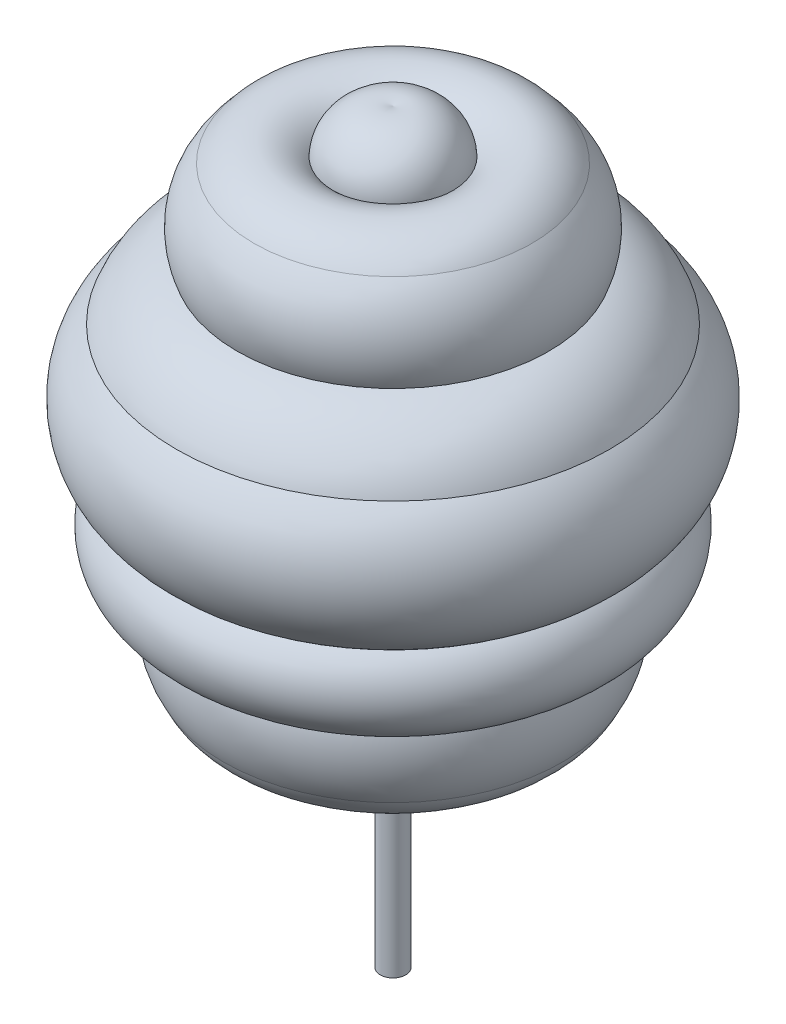
ISO-10303-21;
HEADER;
FILE_DESCRIPTION(('STEP AP214'),'2;1');
FILE_NAME('part.step','',(''),(''),'','','');
FILE_SCHEMA(('AUTOMOTIVE_DESIGN { 1 0 10303 214 1 1 1 1 }'));
ENDSEC;
DATA;
#1=APPLICATION_CONTEXT('core data for automotive mechanical design processes');
#2=APPLICATION_PROTOCOL_DEFINITION('international standard','automotive_design',2000,#1);
#3=PRODUCT_CONTEXT('',#1,'mechanical');
#4=PRODUCT('Part','Part','',(#3));
#5=PRODUCT_RELATED_PRODUCT_CATEGORY('part','',(#4));
#6=PRODUCT_DEFINITION_FORMATION('','',#4);
#7=PRODUCT_DEFINITION_CONTEXT('part definition',#1,'design');
#8=PRODUCT_DEFINITION('design','',#6,#7);
#9=PRODUCT_DEFINITION_SHAPE('','',#8);
#10=(LENGTH_UNIT() NAMED_UNIT(*) SI_UNIT(.MILLI.,.METRE.));
#11=(NAMED_UNIT(*) PLANE_ANGLE_UNIT() SI_UNIT($,.RADIAN.));
#12=(NAMED_UNIT(*) SI_UNIT($,.STERADIAN.) SOLID_ANGLE_UNIT());
#13=UNCERTAINTY_MEASURE_WITH_UNIT(LENGTH_MEASURE(1.E-05),#10,'distance_accuracy_value','');
#14=(GEOMETRIC_REPRESENTATION_CONTEXT(3) GLOBAL_UNCERTAINTY_ASSIGNED_CONTEXT((#13)) GLOBAL_UNIT_ASSIGNED_CONTEXT((#10,
#11,#12)) REPRESENTATION_CONTEXT('',''));
#15=CARTESIAN_POINT('',(0.,0.,0.));
#16=DIRECTION('',(0.,0.,1.));
#17=DIRECTION('',(1.,0.,0.));
#18=AXIS2_PLACEMENT_3D('',#15,#16,#17);
#19=CARTESIAN_POINT('',(0.,0.,0.));
#20=DIRECTION('',(0.,1.,0.));
#21=DIRECTION('',(0.,0.,1.));
#22=AXIS2_PLACEMENT_3D('',#19,#20,#21);
#23=PLANE('',#22);
#24=CARTESIAN_POINT('',(0.,0.,0.));
#25=DIRECTION('',(0.,1.,0.));
#26=DIRECTION('',(0.,0.,1.));
#27=AXIS2_PLACEMENT_3D('',#24,#25,#26);
#28=CIRCLE('',#27,30.);
#29=CARTESIAN_POINT('',(0.,0.,30.));
#30=VERTEX_POINT('',#29);
#31=EDGE_CURVE('E11',#30,#30,#28,.T.);
#32=ORIENTED_EDGE('',*,*,#31,.T.);
#33=EDGE_LOOP('',(#32));
#34=FACE_BOUND('',#33,.T.);
#35=CARTESIAN_POINT('',(0.,0.,0.));
#36=DIRECTION('',(0.,1.,0.));
#37=DIRECTION('',(0.,0.,1.));
#38=AXIS2_PLACEMENT_3D('',#35,#36,#37);
#39=CIRCLE('',#38,139.417105741642);
#40=CARTESIAN_POINT('',(0.,0.,139.417105741642));
#41=VERTEX_POINT('',#40);
#42=EDGE_CURVE('E75',#41,#41,#39,.T.);
#43=ORIENTED_EDGE('',*,*,#42,.F.);
#44=EDGE_LOOP('',(#43));
#45=FACE_BOUND('',#44,.T.);
#46=ADVANCED_FACE('F33',(#34,#45),#23,.F.);
#47=CARTESIAN_POINT('',(0.,99.2068965255332,0.));
#48=DIRECTION('',(0.,1.,0.));
#49=DIRECTION('',(0.,0.,1.));
#50=AXIS2_PLACEMENT_3D('',#47,#48,#49);
#51=TOROIDAL_SURFACE('',#50,139.417105741642,99.2068965255332);
#52=CARTESIAN_POINT('',(0.,54.9088263615796,0.));
#53=DIRECTION('',(0.,1.,0.));
#54=DIRECTION('',(0.,0.,1.));
#55=AXIS2_PLACEMENT_3D('',#52,#53,#54);
#56=CIRCLE('',#55,228.184719756987);
#57=CARTESIAN_POINT('',(0.,54.9088263615796,228.184719756987));
#58=VERTEX_POINT('',#57);
#59=EDGE_CURVE('E72',#58,#58,#56,.T.);
#60=ORIENTED_EDGE('',*,*,#59,.F.);
#61=EDGE_LOOP('',(#60));
#62=FACE_BOUND('',#61,.T.);
#63=ORIENTED_EDGE('',*,*,#42,.T.);
#64=EDGE_LOOP('',(#63));
#65=FACE_BOUND('',#64,.T.);
#66=ADVANCED_FACE('F89',(#62,#65),#51,.T.);
#67=CARTESIAN_POINT('',(0.,166.297519001005,0.));
#68=DIRECTION('',(0.,1.,0.));
#69=DIRECTION('',(0.,0.,1.));
#70=AXIS2_PLACEMENT_3D('',#67,#68,#69);
#71=TOROIDAL_SURFACE('',#70,283.771480500149,124.488267791941);
#72=CARTESIAN_POINT('',(0.,116.008612631882,0.));
#73=DIRECTION('',(0.,1.,0.));
#74=DIRECTION('',(0.,0.,1.));
#75=AXIS2_PLACEMENT_3D('',#72,#73,#74);
#76=CIRCLE('',#75,397.650164695373);
#77=CARTESIAN_POINT('',(0.,116.008612631882,397.650164695373));
#78=VERTEX_POINT('',#77);
#79=EDGE_CURVE('E69',#78,#78,#76,.T.);
#80=ORIENTED_EDGE('',*,*,#79,.F.);
#81=EDGE_LOOP('',(#80));
#82=FACE_BOUND('',#81,.T.);
#83=ORIENTED_EDGE('',*,*,#59,.T.);
#84=EDGE_LOOP('',(#83));
#85=FACE_BOUND('',#84,.T.);
#86=ADVANCED_FACE('F94',(#82,#85),#71,.T.);
#87=CARTESIAN_POINT('',(0.,220.531302933038,0.));
#88=DIRECTION('',(0.,1.,0.));
#89=DIRECTION('',(0.,0.,1.));
#90=AXIS2_PLACEMENT_3D('',#87,#88,#89);
#91=TOROIDAL_SURFACE('',#90,216.378743577582,209.247033197259);
#92=CARTESIAN_POINT('',(0.,287.645111061646,0.));
#93=DIRECTION('',(0.,1.,0.));
#94=DIRECTION('',(0.,0.,1.));
#95=AXIS2_PLACEMENT_3D('',#92,#93,#94);
#96=CIRCLE('',#95,414.570715312896);
#97=CARTESIAN_POINT('',(0.,287.645111061646,414.570715312896));
#98=VERTEX_POINT('',#97);
#99=EDGE_CURVE('E66',#98,#98,#96,.T.);
#100=ORIENTED_EDGE('',*,*,#99,.F.);
#101=EDGE_LOOP('',(#100));
#102=FACE_BOUND('',#101,.T.);
#103=ORIENTED_EDGE('',*,*,#79,.T.);
#104=EDGE_LOOP('',(#103));
#105=FACE_BOUND('',#104,.T.);
#106=ADVANCED_FACE('F101',(#102,#105),#91,.T.);
#107=CARTESIAN_POINT('',(0.,401.126607206565,0.));
#108=DIRECTION('',(0.,1.,0.));
#109=DIRECTION('',(0.,0.,1.));
#110=AXIS2_PLACEMENT_3D('',#107,#108,#109);
#111=TOROIDAL_SURFACE('',#110,414.38855612833,113.481642344733);
#112=CARTESIAN_POINT('',(0.,488.899466331618,0.));
#113=DIRECTION('',(0.,1.,0.));
#114=DIRECTION('',(0.,0.,1.));
#115=AXIS2_PLACEMENT_3D('',#112,#113,#114);
#116=CIRCLE('',#115,486.319136205732);
#117=CARTESIAN_POINT('',(0.,488.899466331618,486.319136205732));
#118=VERTEX_POINT('',#117);
#119=EDGE_CURVE('E63',#118,#118,#116,.T.);
#120=ORIENTED_EDGE('',*,*,#119,.F.);
#121=EDGE_LOOP('',(#120));
#122=FACE_BOUND('',#121,.T.);
#123=ORIENTED_EDGE('',*,*,#99,.T.);
#124=EDGE_LOOP('',(#123));
#125=FACE_BOUND('',#124,.T.);
#126=ADVANCED_FACE('F105',(#122,#125),#111,.T.);
#127=CARTESIAN_POINT('',(0.,656.605914428224,0.));
#128=DIRECTION('',(0.,1.,0.));
#129=DIRECTION('',(0.,0.,1.));
#130=AXIS2_PLACEMENT_3D('',#127,#128,#129);
#131=TOROIDAL_SURFACE('',#130,371.0751291167,203.486200768298);
#132=CARTESIAN_POINT('',(0.,806.811755215966,0.));
#133=DIRECTION('',(0.,1.,0.));
#134=DIRECTION('',(0.,0.,1.));
#135=AXIS2_PLACEMENT_3D('',#132,#133,#134);
#136=CIRCLE('',#135,508.351635833486);
#137=CARTESIAN_POINT('',(0.,806.811755215966,508.351635833486));
#138=VERTEX_POINT('',#137);
#139=EDGE_CURVE('E60',#138,#138,#136,.T.);
#140=ORIENTED_EDGE('',*,*,#139,.F.);
#141=EDGE_LOOP('',(#140));
#142=FACE_BOUND('',#141,.T.);
#143=ORIENTED_EDGE('',*,*,#119,.T.);
#144=EDGE_LOOP('',(#143));
#145=FACE_BOUND('',#144,.T.);
#146=ADVANCED_FACE('F109',(#142,#145),#131,.T.);
#147=CARTESIAN_POINT('',(0.,735.539797725192,0.));
#148=DIRECTION('',(0.,1.,0.));
#149=DIRECTION('',(0.,0.,1.));
#150=AXIS2_PLACEMENT_3D('',#147,#148,#149);
#151=TOROIDAL_SURFACE('',#150,315.980471279254,205.149596335254);
#152=CARTESIAN_POINT('',(0.,934.59602823058,0.));
#153=DIRECTION('',(0.,1.,0.));
#154=DIRECTION('',(0.,0.,1.));
#155=AXIS2_PLACEMENT_3D('',#152,#153,#154);
#156=CIRCLE('',#155,365.608829840703);
#157=CARTESIAN_POINT('',(0.,934.59602823058,365.608829840703));
#158=VERTEX_POINT('',#157);
#159=EDGE_CURVE('E55',#158,#158,#156,.T.);
#160=ORIENTED_EDGE('',*,*,#159,.F.);
#161=EDGE_LOOP('',(#160));
#162=FACE_BOUND('',#161,.T.);
#163=ORIENTED_EDGE('',*,*,#139,.T.);
#164=EDGE_LOOP('',(#163));
#165=FACE_BOUND('',#164,.T.);
#166=ADVANCED_FACE('F113',(#162,#165),#151,.T.);
#167=CARTESIAN_POINT('',(0.,1003.87058263717,0.));
#168=DIRECTION('',(0.,1.,0.));
#169=DIRECTION('',(0.,0.,1.));
#170=AXIS2_PLACEMENT_3D('',#167,#168,#169);
#171=TOROIDAL_SURFACE('',#170,193.371671685515,185.646444990488);
#172=CARTESIAN_POINT('',(0.,1133.77536934445,0.));
#173=DIRECTION('',(0.,1.,0.));
#174=DIRECTION('',(0.,0.,1.));
#175=AXIS2_PLACEMENT_3D('',#172,#173,#174);
#176=CIRCLE('',#175,325.99651448709);
#177=CARTESIAN_POINT('',(0.,1133.77536934445,325.99651448709));
#178=VERTEX_POINT('',#177);
#179=EDGE_CURVE('E52',#178,#178,#176,.T.);
#180=ORIENTED_EDGE('',*,*,#179,.F.);
#181=EDGE_LOOP('',(#180));
#182=FACE_BOUND('',#181,.T.);
#183=ORIENTED_EDGE('',*,*,#159,.T.);
#184=EDGE_LOOP('',(#183));
#185=FACE_BOUND('',#184,.T.);
#186=ADVANCED_FACE('F117',(#182,#185),#171,.T.);
#187=CARTESIAN_POINT('',(0.,1060.73551966089,0.));
#188=DIRECTION('',(0.,1.,0.));
#189=DIRECTION('',(0.,0.,1.));
#190=AXIS2_PLACEMENT_3D('',#187,#188,#189);
#191=TOROIDAL_SURFACE('',#190,226.889478801635,123.113866660727);
#192=CARTESIAN_POINT('',(0.,1147.37043245826,0.));
#193=DIRECTION('',(0.,1.,0.));
#194=DIRECTION('',(0.,0.,1.));
#195=AXIS2_PLACEMENT_3D('',#192,#193,#194);
#196=CIRCLE('',#195,139.417105741642);
#197=CARTESIAN_POINT('',(0.,1147.37043245826,139.417105741642));
#198=VERTEX_POINT('',#197);
#199=EDGE_CURVE('E50',#198,#198,#196,.T.);
#200=ORIENTED_EDGE('',*,*,#199,.F.);
#201=EDGE_LOOP('',(#200));
#202=FACE_BOUND('',#201,.T.);
#203=ORIENTED_EDGE('',*,*,#179,.T.);
#204=EDGE_LOOP('',(#203));
#205=FACE_BOUND('',#204,.T.);
#206=ADVANCED_FACE('F46',(#202,#205),#191,.T.);
#207=CARTESIAN_POINT('',(0.,1142.50458931729,28.3521252394037));
#208=DIRECTION('',(-1.,0.,0.));
#209=DIRECTION('',(0.,0.,1.));
#210=AXIS2_PLACEMENT_3D('',#207,#208,#209);
#211=CIRCLE('',#210,111.171517590771);
#212=TRIMMED_CURVE('',#211,(PARAMETER_VALUE(-1.82867554985619)),
(PARAMETER_VALUE(1.82867554985619)),.T.,.PARAMETER.);
#213=CARTESIAN_POINT('',(0.,1142.50458931729,0.));
#214=DIRECTION('',(0.,1.,0.));
#215=AXIS1_PLACEMENT('',#213,#214);
#216=SURFACE_OF_REVOLUTION('',#212,#215);
#217=CARTESIAN_POINT('',(0.,1250.,0.));
#218=VERTEX_POINT('',#217);
#219=VERTEX_LOOP('',#218);
#220=FACE_BOUND('',#219,.T.);
#221=ORIENTED_EDGE('',*,*,#199,.T.);
#222=EDGE_LOOP('',(#221));
#223=FACE_BOUND('',#222,.T.);
#224=ADVANCED_FACE('F43',(#220,#223),#216,.T.);
#225=CARTESIAN_POINT('',(0.,500.,0.));
#226=DIRECTION('',(0.,-1.,0.));
#227=DIRECTION('',(0.,0.,-1.));
#228=AXIS2_PLACEMENT_3D('',#225,#226,#227);
#229=CYLINDRICAL_SURFACE('',#228,30.);
#230=CARTESIAN_POINT('',(0.,-500.,0.));
#231=DIRECTION('',(0.,1.,0.));
#232=DIRECTION('',(0.,0.,1.));
#233=AXIS2_PLACEMENT_3D('',#230,#231,#232);
#234=CIRCLE('',#233,30.);
#235=CARTESIAN_POINT('',(0.,-500.,30.));
#236=VERTEX_POINT('',#235);
#237=EDGE_CURVE('E40',#236,#236,#234,.T.);
#238=ORIENTED_EDGE('',*,*,#237,.T.);
#239=EDGE_LOOP('',(#238));
#240=FACE_BOUND('',#239,.T.);
#241=ORIENTED_EDGE('',*,*,#31,.F.);
#242=EDGE_LOOP('',(#241));
#243=FACE_BOUND('',#242,.T.);
#244=ADVANCED_FACE('F35',(#240,#243),#229,.T.);
#245=CARTESIAN_POINT('',(0.,-500.,0.));
#246=DIRECTION('',(0.,1.,0.));
#247=DIRECTION('',(0.,0.,1.));
#248=AXIS2_PLACEMENT_3D('',#245,#246,#247);
#249=PLANE('',#248);
#250=ORIENTED_EDGE('',*,*,#237,.F.);
#251=EDGE_LOOP('',(#250));
#252=FACE_BOUND('',#251,.T.);
#253=ADVANCED_FACE('F82',(#252),#249,.F.);
#254=CLOSED_SHELL('',(#46,#66,#86,#106,#126,#146,#166,#186,#206,#224,#244,#253));
#255=MANIFOLD_SOLID_BREP('B2',#254);
#256=ADVANCED_BREP_SHAPE_REPRESENTATION('',(#18,#255),#14);
#257=SHAPE_DEFINITION_REPRESENTATION(#9,#256);
ENDSEC;
END-ISO-10303-21;
